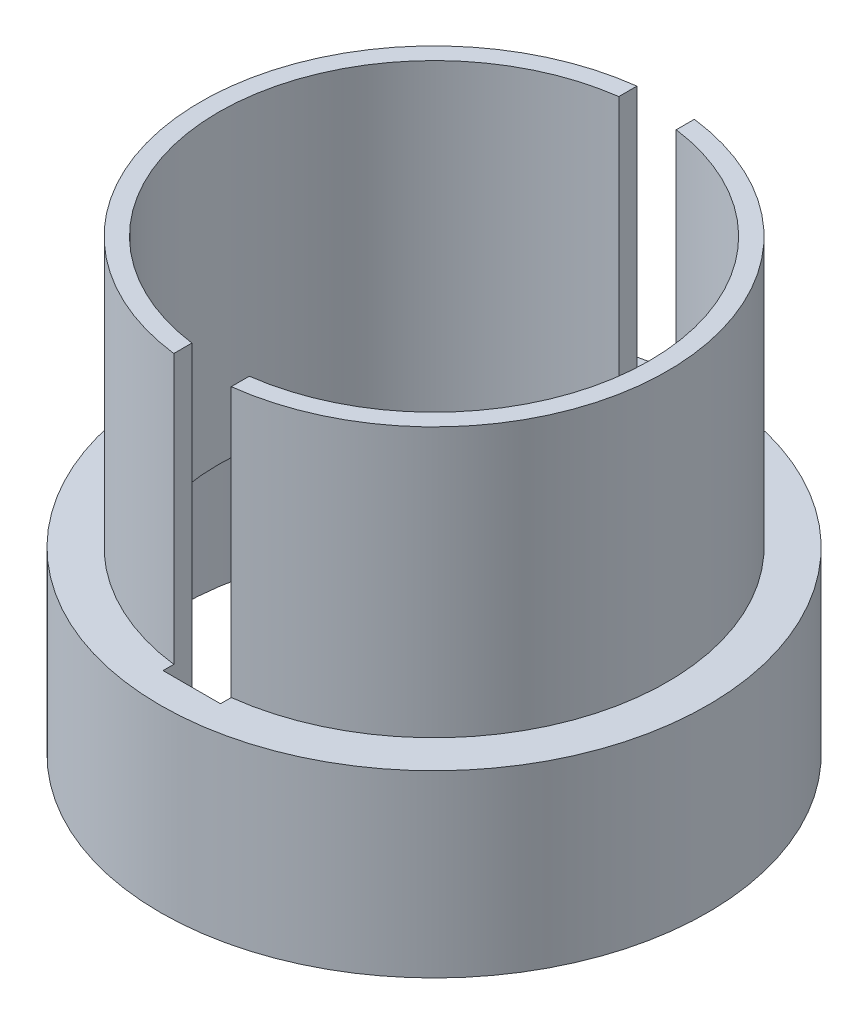
ISO-10303-21;
HEADER;
FILE_DESCRIPTION(('STEP AP214'),'2;1');
FILE_NAME('part.step','',(''),(''),'','','');
FILE_SCHEMA(('AUTOMOTIVE_DESIGN { 1 0 10303 214 1 1 1 1 }'));
ENDSEC;
DATA;
#1=APPLICATION_CONTEXT('core data for automotive mechanical design processes');
#2=APPLICATION_PROTOCOL_DEFINITION('international standard','automotive_design',2000,#1);
#3=PRODUCT_CONTEXT('',#1,'mechanical');
#4=PRODUCT('Part','Part','',(#3));
#5=PRODUCT_RELATED_PRODUCT_CATEGORY('part','',(#4));
#6=PRODUCT_DEFINITION_FORMATION('','',#4);
#7=PRODUCT_DEFINITION_CONTEXT('part definition',#1,'design');
#8=PRODUCT_DEFINITION('design','',#6,#7);
#9=PRODUCT_DEFINITION_SHAPE('','',#8);
#10=(LENGTH_UNIT() NAMED_UNIT(*) SI_UNIT(.MILLI.,.METRE.));
#11=(NAMED_UNIT(*) PLANE_ANGLE_UNIT() SI_UNIT($,.RADIAN.));
#12=(NAMED_UNIT(*) SI_UNIT($,.STERADIAN.) SOLID_ANGLE_UNIT());
#13=UNCERTAINTY_MEASURE_WITH_UNIT(LENGTH_MEASURE(1.E-05),#10,'distance_accuracy_value','');
#14=(GEOMETRIC_REPRESENTATION_CONTEXT(3) GLOBAL_UNCERTAINTY_ASSIGNED_CONTEXT((#13)) GLOBAL_UNIT_ASSIGNED_CONTEXT((#10,
#11,#12)) REPRESENTATION_CONTEXT('',''));
#15=CARTESIAN_POINT('',(0.,0.,0.));
#16=DIRECTION('',(0.,0.,1.));
#17=DIRECTION('',(1.,0.,0.));
#18=AXIS2_PLACEMENT_3D('',#15,#16,#17);
#19=CARTESIAN_POINT('',(0.,10.,0.));
#20=DIRECTION('',(0.,1.,0.));
#21=DIRECTION('',(0.,0.,1.));
#22=AXIS2_PLACEMENT_3D('',#19,#20,#21);
#23=PLANE('',#22);
#24=DIRECTION('',(0.,0.,-1.));
#25=VECTOR('',#24,1.);
#26=CARTESIAN_POINT('',(1.6,10.,0.));
#27=LINE('',#26,#25);
#28=CARTESIAN_POINT('',(1.6,10.,-12.9011627382961));
#29=VERTEX_POINT('',#28);
#30=CARTESIAN_POINT('',(1.6,10.,-13.5));
#31=VERTEX_POINT('',#30);
#32=EDGE_CURVE('E256',#29,#31,#27,.T.);
#33=ORIENTED_EDGE('',*,*,#32,.F.);
#34=CARTESIAN_POINT('',(0.,10.,0.));
#35=DIRECTION('',(0.,1.,0.));
#36=DIRECTION('',(0.,0.,1.));
#37=AXIS2_PLACEMENT_3D('',#34,#35,#36);
#38=CIRCLE('',#37,13.);
#39=CARTESIAN_POINT('',(1.6,10.,12.9011627382961));
#40=VERTEX_POINT('',#39);
#41=EDGE_CURVE('E172',#40,#29,#38,.T.);
#42=ORIENTED_EDGE('',*,*,#41,.F.);
#43=DIRECTION('',(0.,0.,1.));
#44=VECTOR('',#43,1.);
#45=CARTESIAN_POINT('',(1.6,10.,0.));
#46=LINE('',#45,#44);
#47=CARTESIAN_POINT('',(1.6,10.,13.5));
#48=VERTEX_POINT('',#47);
#49=EDGE_CURVE('E245',#40,#48,#46,.T.);
#50=ORIENTED_EDGE('',*,*,#49,.T.);
#51=DIRECTION('',(1.,0.,0.));
#52=VECTOR('',#51,1.);
#53=CARTESIAN_POINT('',(0.,10.,13.5));
#54=LINE('',#53,#52);
#55=CARTESIAN_POINT('',(-1.6,10.,13.5));
#56=VERTEX_POINT('',#55);
#57=EDGE_CURVE('E163',#56,#48,#54,.T.);
#58=ORIENTED_EDGE('',*,*,#57,.F.);
#59=DIRECTION('',(0.,0.,1.));
#60=VECTOR('',#59,1.);
#61=CARTESIAN_POINT('',(-1.6,10.,0.));
#62=LINE('',#61,#60);
#63=CARTESIAN_POINT('',(-1.6,10.,12.9011627382961));
#64=VERTEX_POINT('',#63);
#65=EDGE_CURVE('E226',#64,#56,#62,.T.);
#66=ORIENTED_EDGE('',*,*,#65,.F.);
#67=CARTESIAN_POINT('',(-1.6,10.,-12.9011627382961));
#68=VERTEX_POINT('',#67);
#69=EDGE_CURVE('E161',#68,#64,#38,.T.);
#70=ORIENTED_EDGE('',*,*,#69,.F.);
#71=DIRECTION('',(0.,0.,-1.));
#72=VECTOR('',#71,1.);
#73=CARTESIAN_POINT('',(-1.6,10.,0.));
#74=LINE('',#73,#72);
#75=CARTESIAN_POINT('',(-1.6,10.,-13.5));
#76=VERTEX_POINT('',#75);
#77=EDGE_CURVE('E55',#68,#76,#74,.T.);
#78=ORIENTED_EDGE('',*,*,#77,.T.);
#79=DIRECTION('',(1.,0.,0.));
#80=VECTOR('',#79,1.);
#81=CARTESIAN_POINT('',(0.,10.,-13.5));
#82=LINE('',#81,#80);
#83=EDGE_CURVE('E156',#76,#31,#82,.T.);
#84=ORIENTED_EDGE('',*,*,#83,.T.);
#85=EDGE_LOOP('',(#33,#42,#50,#58,#66,#70,#78,#84));
#86=FACE_BOUND('',#85,.T.);
#87=CARTESIAN_POINT('',(0.,10.,0.));
#88=DIRECTION('',(0.,1.,0.));
#89=DIRECTION('',(0.,0.,1.));
#90=AXIS2_PLACEMENT_3D('',#87,#88,#89);
#91=CIRCLE('',#90,15.25);
#92=CARTESIAN_POINT('',(0.,10.,15.25));
#93=VERTEX_POINT('',#92);
#94=EDGE_CURVE('E189',#93,#93,#91,.T.);
#95=ORIENTED_EDGE('',*,*,#94,.T.);
#96=EDGE_LOOP('',(#95));
#97=FACE_BOUND('',#96,.T.);
#98=ADVANCED_FACE('F39',(#86,#97),#23,.T.);
#99=CARTESIAN_POINT('',(0.,8.,0.));
#100=DIRECTION('',(0.,1.,0.));
#101=DIRECTION('',(0.,0.,1.));
#102=AXIS2_PLACEMENT_3D('',#99,#100,#101);
#103=PLANE('',#102);
#104=CARTESIAN_POINT('',(0.,8.,0.));
#105=DIRECTION('',(0.,1.,0.));
#106=DIRECTION('',(0.,0.,1.));
#107=AXIS2_PLACEMENT_3D('',#104,#105,#106);
#108=CIRCLE('',#107,14.25);
#109=CARTESIAN_POINT('',(0.,8.,14.25));
#110=VERTEX_POINT('',#109);
#111=EDGE_CURVE('E180',#110,#110,#108,.T.);
#112=ORIENTED_EDGE('',*,*,#111,.F.);
#113=EDGE_LOOP('',(#112));
#114=FACE_BOUND('',#113,.T.);
#115=CARTESIAN_POINT('',(0.,8.,0.));
#116=DIRECTION('',(0.,1.,0.));
#117=DIRECTION('',(0.,0.,1.));
#118=AXIS2_PLACEMENT_3D('',#115,#116,#117);
#119=CIRCLE('',#118,12.);
#120=CARTESIAN_POINT('',(1.6,8.,11.8928549978548));
#121=VERTEX_POINT('',#120);
#122=CARTESIAN_POINT('',(1.6,8.,-11.8928549978548));
#123=VERTEX_POINT('',#122);
#124=EDGE_CURVE('E176',#121,#123,#119,.T.);
#125=ORIENTED_EDGE('',*,*,#124,.T.);
#126=DIRECTION('',(0.,0.,-1.));
#127=VECTOR('',#126,1.);
#128=CARTESIAN_POINT('',(1.6,8.,0.));
#129=LINE('',#128,#127);
#130=CARTESIAN_POINT('',(1.6,8.,-13.5));
#131=VERTEX_POINT('',#130);
#132=EDGE_CURVE('E259',#123,#131,#129,.T.);
#133=ORIENTED_EDGE('',*,*,#132,.T.);
#134=DIRECTION('',(1.,0.,0.));
#135=VECTOR('',#134,1.);
#136=CARTESIAN_POINT('',(0.,8.,-13.5));
#137=LINE('',#136,#135);
#138=CARTESIAN_POINT('',(-1.6,8.,-13.5));
#139=VERTEX_POINT('',#138);
#140=EDGE_CURVE('E11',#139,#131,#137,.T.);
#141=ORIENTED_EDGE('',*,*,#140,.F.);
#142=DIRECTION('',(0.,0.,-1.));
#143=VECTOR('',#142,1.);
#144=CARTESIAN_POINT('',(-1.6,8.,0.));
#145=LINE('',#144,#143);
#146=CARTESIAN_POINT('',(-1.6,8.,-11.8928549978548));
#147=VERTEX_POINT('',#146);
#148=EDGE_CURVE('E253',#147,#139,#145,.T.);
#149=ORIENTED_EDGE('',*,*,#148,.F.);
#150=CARTESIAN_POINT('',(-1.6,8.,11.8928549978548));
#151=VERTEX_POINT('',#150);
#152=EDGE_CURVE('E148',#147,#151,#119,.T.);
#153=ORIENTED_EDGE('',*,*,#152,.T.);
#154=DIRECTION('',(0.,0.,1.));
#155=VECTOR('',#154,1.);
#156=CARTESIAN_POINT('',(-1.6,8.,0.));
#157=LINE('',#156,#155);
#158=CARTESIAN_POINT('',(-1.6,8.,13.5));
#159=VERTEX_POINT('',#158);
#160=EDGE_CURVE('E215',#151,#159,#157,.T.);
#161=ORIENTED_EDGE('',*,*,#160,.T.);
#162=DIRECTION('',(1.,0.,0.));
#163=VECTOR('',#162,1.);
#164=CARTESIAN_POINT('',(0.,8.,13.5));
#165=LINE('',#164,#163);
#166=CARTESIAN_POINT('',(1.6,8.,13.5));
#167=VERTEX_POINT('',#166);
#168=EDGE_CURVE('E48',#159,#167,#165,.T.);
#169=ORIENTED_EDGE('',*,*,#168,.T.);
#170=DIRECTION('',(0.,0.,1.));
#171=VECTOR('',#170,1.);
#172=CARTESIAN_POINT('',(1.6,8.,0.));
#173=LINE('',#172,#171);
#174=EDGE_CURVE('E213',#121,#167,#173,.T.);
#175=ORIENTED_EDGE('',*,*,#174,.F.);
#176=EDGE_LOOP('',(#125,#133,#141,#149,#153,#161,#169,#175));
#177=FACE_BOUND('',#176,.T.);
#178=ADVANCED_FACE('F212',(#114,#177),#103,.F.);
#179=CARTESIAN_POINT('',(0.,8.,0.));
#180=DIRECTION('',(0.,1.,0.));
#181=DIRECTION('',(0.,0.,1.));
#182=AXIS2_PLACEMENT_3D('',#179,#180,#181);
#183=CYLINDRICAL_SURFACE('',#182,12.);
#184=DIRECTION('',(0.,1.,0.));
#185=VECTOR('',#184,1.);
#186=CARTESIAN_POINT('',(-1.6,0.,-11.8928549978548));
#187=LINE('',#186,#185);
#188=CARTESIAN_POINT('',(-1.6,25.,-11.8928549978548));
#189=VERTEX_POINT('',#188);
#190=EDGE_CURVE('E130',#147,#189,#187,.T.);
#191=ORIENTED_EDGE('',*,*,#190,.T.);
#192=CARTESIAN_POINT('',(0.,25.,0.));
#193=DIRECTION('',(0.,1.,0.));
#194=DIRECTION('',(0.,0.,1.));
#195=AXIS2_PLACEMENT_3D('',#192,#193,#194);
#196=CIRCLE('',#195,12.);
#197=CARTESIAN_POINT('',(-1.6,25.,11.8928549978548));
#198=VERTEX_POINT('',#197);
#199=EDGE_CURVE('E146',#189,#198,#196,.T.);
#200=ORIENTED_EDGE('',*,*,#199,.T.);
#201=DIRECTION('',(0.,1.,0.));
#202=VECTOR('',#201,1.);
#203=CARTESIAN_POINT('',(-1.6,0.,11.8928549978548));
#204=LINE('',#203,#202);
#205=EDGE_CURVE('E228',#151,#198,#204,.T.);
#206=ORIENTED_EDGE('',*,*,#205,.F.);
#207=ORIENTED_EDGE('',*,*,#152,.F.);
#208=EDGE_LOOP('',(#191,#200,#206,#207));
#209=FACE_BOUND('',#208,.T.);
#210=ADVANCED_FACE('F144',(#209),#183,.F.);
#211=CARTESIAN_POINT('',(1.6,25.,11.8928549978548));
#212=VERTEX_POINT('',#211);
#213=CARTESIAN_POINT('',(1.6,25.,-11.8928549978548));
#214=VERTEX_POINT('',#213);
#215=EDGE_CURVE('E155',#212,#214,#196,.T.);
#216=ORIENTED_EDGE('',*,*,#215,.T.);
#217=DIRECTION('',(0.,1.,0.));
#218=VECTOR('',#217,1.);
#219=CARTESIAN_POINT('',(1.6,0.,-11.8928549978548));
#220=LINE('',#219,#218);
#221=EDGE_CURVE('E150',#123,#214,#220,.T.);
#222=ORIENTED_EDGE('',*,*,#221,.F.);
#223=ORIENTED_EDGE('',*,*,#124,.F.);
#224=DIRECTION('',(0.,1.,0.));
#225=VECTOR('',#224,1.);
#226=CARTESIAN_POINT('',(1.6,0.,11.8928549978548));
#227=LINE('',#226,#225);
#228=EDGE_CURVE('E233',#121,#212,#227,.T.);
#229=ORIENTED_EDGE('',*,*,#228,.T.);
#230=EDGE_LOOP('',(#216,#222,#223,#229));
#231=FACE_BOUND('',#230,.T.);
#232=ADVANCED_FACE('F295',(#231),#183,.F.);
#233=CARTESIAN_POINT('',(0.,25.,0.));
#234=DIRECTION('',(0.,1.,0.));
#235=DIRECTION('',(0.,0.,1.));
#236=AXIS2_PLACEMENT_3D('',#233,#234,#235);
#237=PLANE('',#236);
#238=ORIENTED_EDGE('',*,*,#199,.F.);
#239=DIRECTION('',(0.,0.,-1.));
#240=VECTOR('',#239,1.);
#241=CARTESIAN_POINT('',(-1.6,25.,0.));
#242=LINE('',#241,#240);
#243=CARTESIAN_POINT('',(-1.6,25.,-12.9011627382961));
#244=VERTEX_POINT('',#243);
#245=EDGE_CURVE('E127',#189,#244,#242,.T.);
#246=ORIENTED_EDGE('',*,*,#245,.T.);
#247=CARTESIAN_POINT('',(0.,25.,0.));
#248=DIRECTION('',(0.,1.,0.));
#249=DIRECTION('',(0.,0.,1.));
#250=AXIS2_PLACEMENT_3D('',#247,#248,#249);
#251=CIRCLE('',#250,13.);
#252=CARTESIAN_POINT('',(-1.6,25.,12.9011627382961));
#253=VERTEX_POINT('',#252);
#254=EDGE_CURVE('E171',#244,#253,#251,.T.);
#255=ORIENTED_EDGE('',*,*,#254,.T.);
#256=DIRECTION('',(0.,0.,1.));
#257=VECTOR('',#256,1.);
#258=CARTESIAN_POINT('',(-1.6,25.,0.));
#259=LINE('',#258,#257);
#260=EDGE_CURVE('E63',#198,#253,#259,.T.);
#261=ORIENTED_EDGE('',*,*,#260,.F.);
#262=EDGE_LOOP('',(#238,#246,#255,#261));
#263=FACE_BOUND('',#262,.T.);
#264=ADVANCED_FACE('F153',(#263),#237,.T.);
#265=DIRECTION('',(0.,0.,-1.));
#266=VECTOR('',#265,1.);
#267=CARTESIAN_POINT('',(1.6,25.,0.));
#268=LINE('',#267,#266);
#269=CARTESIAN_POINT('',(1.6,25.,-12.9011627382961));
#270=VERTEX_POINT('',#269);
#271=EDGE_CURVE('E138',#214,#270,#268,.T.);
#272=ORIENTED_EDGE('',*,*,#271,.F.);
#273=ORIENTED_EDGE('',*,*,#215,.F.);
#274=DIRECTION('',(0.,0.,1.));
#275=VECTOR('',#274,1.);
#276=CARTESIAN_POINT('',(1.6,25.,0.));
#277=LINE('',#276,#275);
#278=CARTESIAN_POINT('',(1.6,25.,12.9011627382961));
#279=VERTEX_POINT('',#278);
#280=EDGE_CURVE('E274',#212,#279,#277,.T.);
#281=ORIENTED_EDGE('',*,*,#280,.T.);
#282=EDGE_CURVE('E167',#279,#270,#251,.T.);
#283=ORIENTED_EDGE('',*,*,#282,.T.);
#284=EDGE_LOOP('',(#272,#273,#281,#283));
#285=FACE_BOUND('',#284,.T.);
#286=ADVANCED_FACE('F278',(#285),#237,.T.);
#287=CARTESIAN_POINT('',(0.,25.,0.));
#288=DIRECTION('',(0.,-1.,0.));
#289=DIRECTION('',(0.,0.,-1.));
#290=AXIS2_PLACEMENT_3D('',#287,#288,#289);
#291=CYLINDRICAL_SURFACE('',#290,13.);
#292=DIRECTION('',(0.,-1.,0.));
#293=VECTOR('',#292,1.);
#294=CARTESIAN_POINT('',(-1.6,25.,-12.9011627382961));
#295=LINE('',#294,#293);
#296=EDGE_CURVE('E132',#68,#244,#295,.F.);
#297=ORIENTED_EDGE('',*,*,#296,.F.);
#298=ORIENTED_EDGE('',*,*,#69,.T.);
#299=DIRECTION('',(0.,-1.,0.));
#300=VECTOR('',#299,1.);
#301=CARTESIAN_POINT('',(-1.6,25.,12.9011627382961));
#302=LINE('',#301,#300);
#303=EDGE_CURVE('E193',#64,#253,#302,.F.);
#304=ORIENTED_EDGE('',*,*,#303,.T.);
#305=ORIENTED_EDGE('',*,*,#254,.F.);
#306=EDGE_LOOP('',(#297,#298,#304,#305));
#307=FACE_BOUND('',#306,.T.);
#308=ADVANCED_FACE('F307',(#307),#291,.T.);
#309=ORIENTED_EDGE('',*,*,#41,.T.);
#310=DIRECTION('',(0.,-1.,0.));
#311=VECTOR('',#310,1.);
#312=CARTESIAN_POINT('',(1.6,25.,-12.9011627382961));
#313=LINE('',#312,#311);
#314=EDGE_CURVE('E204',#29,#270,#313,.F.);
#315=ORIENTED_EDGE('',*,*,#314,.T.);
#316=ORIENTED_EDGE('',*,*,#282,.F.);
#317=DIRECTION('',(0.,-1.,0.));
#318=VECTOR('',#317,1.);
#319=CARTESIAN_POINT('',(1.6,25.,12.9011627382961));
#320=LINE('',#319,#318);
#321=EDGE_CURVE('E199',#40,#279,#320,.F.);
#322=ORIENTED_EDGE('',*,*,#321,.F.);
#323=EDGE_LOOP('',(#309,#315,#316,#322));
#324=FACE_BOUND('',#323,.T.);
#325=ADVANCED_FACE('F271',(#324),#291,.T.);
#326=CARTESIAN_POINT('',(0.,10.,0.));
#327=DIRECTION('',(0.,-1.,0.));
#328=DIRECTION('',(0.,0.,-1.));
#329=AXIS2_PLACEMENT_3D('',#326,#327,#328);
#330=CYLINDRICAL_SURFACE('',#329,14.25);
#331=CARTESIAN_POINT('',(0.,0.,0.));
#332=DIRECTION('',(0.,1.,0.));
#333=DIRECTION('',(0.,0.,1.));
#334=AXIS2_PLACEMENT_3D('',#331,#332,#333);
#335=CIRCLE('',#334,14.25);
#336=CARTESIAN_POINT('',(0.,0.,14.25));
#337=VERTEX_POINT('',#336);
#338=EDGE_CURVE('E184',#337,#337,#335,.T.);
#339=ORIENTED_EDGE('',*,*,#338,.F.);
#340=EDGE_LOOP('',(#339));
#341=FACE_BOUND('',#340,.T.);
#342=ORIENTED_EDGE('',*,*,#111,.T.);
#343=EDGE_LOOP('',(#342));
#344=FACE_BOUND('',#343,.T.);
#345=ADVANCED_FACE('F314',(#341,#344),#330,.F.);
#346=CARTESIAN_POINT('',(0.,0.,0.));
#347=DIRECTION('',(0.,1.,0.));
#348=DIRECTION('',(0.,0.,1.));
#349=AXIS2_PLACEMENT_3D('',#346,#347,#348);
#350=PLANE('',#349);
#351=CARTESIAN_POINT('',(0.,0.,0.));
#352=DIRECTION('',(0.,1.,0.));
#353=DIRECTION('',(0.,0.,1.));
#354=AXIS2_PLACEMENT_3D('',#351,#352,#353);
#355=CIRCLE('',#354,15.25);
#356=CARTESIAN_POINT('',(0.,0.,15.25));
#357=VERTEX_POINT('',#356);
#358=EDGE_CURVE('E188',#357,#357,#355,.T.);
#359=ORIENTED_EDGE('',*,*,#358,.F.);
#360=EDGE_LOOP('',(#359));
#361=FACE_BOUND('',#360,.T.);
#362=ORIENTED_EDGE('',*,*,#338,.T.);
#363=EDGE_LOOP('',(#362));
#364=FACE_BOUND('',#363,.T.);
#365=ADVANCED_FACE('F325',(#361,#364),#350,.F.);
#366=CARTESIAN_POINT('',(0.,10.,0.));
#367=DIRECTION('',(0.,-1.,0.));
#368=DIRECTION('',(0.,0.,-1.));
#369=AXIS2_PLACEMENT_3D('',#366,#367,#368);
#370=CYLINDRICAL_SURFACE('',#369,15.25);
#371=ORIENTED_EDGE('',*,*,#94,.F.);
#372=EDGE_LOOP('',(#371));
#373=FACE_BOUND('',#372,.T.);
#374=ORIENTED_EDGE('',*,*,#358,.T.);
#375=EDGE_LOOP('',(#374));
#376=FACE_BOUND('',#375,.T.);
#377=ADVANCED_FACE('F41',(#373,#376),#370,.T.);
#378=CARTESIAN_POINT('',(0.,0.,13.5));
#379=DIRECTION('',(0.,0.,1.));
#380=DIRECTION('',(1.,0.,0.));
#381=AXIS2_PLACEMENT_3D('',#378,#379,#380);
#382=PLANE('',#381);
#383=ORIENTED_EDGE('',*,*,#57,.T.);
#384=DIRECTION('',(0.,1.,0.));
#385=VECTOR('',#384,1.);
#386=CARTESIAN_POINT('',(1.6,0.,13.5));
#387=LINE('',#386,#385);
#388=EDGE_CURVE('E139',#167,#48,#387,.T.);
#389=ORIENTED_EDGE('',*,*,#388,.F.);
#390=ORIENTED_EDGE('',*,*,#168,.F.);
#391=DIRECTION('',(0.,1.,0.));
#392=VECTOR('',#391,1.);
#393=CARTESIAN_POINT('',(-1.6,0.,13.5));
#394=LINE('',#393,#392);
#395=EDGE_CURVE('E221',#159,#56,#394,.T.);
#396=ORIENTED_EDGE('',*,*,#395,.T.);
#397=EDGE_LOOP('',(#383,#389,#390,#396));
#398=FACE_BOUND('',#397,.T.);
#399=ADVANCED_FACE('F220',(#398),#382,.F.);
#400=CARTESIAN_POINT('',(1.6,0.,0.));
#401=DIRECTION('',(-1.,0.,0.));
#402=DIRECTION('',(0.,0.,1.));
#403=AXIS2_PLACEMENT_3D('',#400,#401,#402);
#404=PLANE('',#403);
#405=ORIENTED_EDGE('',*,*,#174,.T.);
#406=ORIENTED_EDGE('',*,*,#388,.T.);
#407=ORIENTED_EDGE('',*,*,#49,.F.);
#408=ORIENTED_EDGE('',*,*,#321,.T.);
#409=ORIENTED_EDGE('',*,*,#280,.F.);
#410=ORIENTED_EDGE('',*,*,#228,.F.);
#411=EDGE_LOOP('',(#405,#406,#407,#408,#409,#410));
#412=FACE_BOUND('',#411,.T.);
#413=ADVANCED_FACE('F265',(#412),#404,.T.);
#414=CARTESIAN_POINT('',(-1.6,0.,0.));
#415=DIRECTION('',(-1.,0.,0.));
#416=DIRECTION('',(0.,0.,1.));
#417=AXIS2_PLACEMENT_3D('',#414,#415,#416);
#418=PLANE('',#417);
#419=ORIENTED_EDGE('',*,*,#205,.T.);
#420=ORIENTED_EDGE('',*,*,#260,.T.);
#421=ORIENTED_EDGE('',*,*,#303,.F.);
#422=ORIENTED_EDGE('',*,*,#65,.T.);
#423=ORIENTED_EDGE('',*,*,#395,.F.);
#424=ORIENTED_EDGE('',*,*,#160,.F.);
#425=EDGE_LOOP('',(#419,#420,#421,#422,#423,#424));
#426=FACE_BOUND('',#425,.T.);
#427=ADVANCED_FACE('F224',(#426),#418,.F.);
#428=CARTESIAN_POINT('',(0.,0.,-13.5));
#429=DIRECTION('',(0.,0.,1.));
#430=DIRECTION('',(1.,0.,0.));
#431=AXIS2_PLACEMENT_3D('',#428,#429,#430);
#432=PLANE('',#431);
#433=DIRECTION('',(0.,1.,0.));
#434=VECTOR('',#433,1.);
#435=CARTESIAN_POINT('',(-1.6,0.,-13.5));
#436=LINE('',#435,#434);
#437=EDGE_CURVE('E151',#139,#76,#436,.T.);
#438=ORIENTED_EDGE('',*,*,#437,.F.);
#439=ORIENTED_EDGE('',*,*,#140,.T.);
#440=DIRECTION('',(0.,1.,0.));
#441=VECTOR('',#440,1.);
#442=CARTESIAN_POINT('',(1.6,0.,-13.5));
#443=LINE('',#442,#441);
#444=EDGE_CURVE('E242',#131,#31,#443,.T.);
#445=ORIENTED_EDGE('',*,*,#444,.T.);
#446=ORIENTED_EDGE('',*,*,#83,.F.);
#447=EDGE_LOOP('',(#438,#439,#445,#446));
#448=FACE_BOUND('',#447,.T.);
#449=ADVANCED_FACE('F300',(#448),#432,.T.);
#450=CARTESIAN_POINT('',(1.6,0.,0.));
#451=DIRECTION('',(1.,0.,0.));
#452=DIRECTION('',(0.,0.,-1.));
#453=AXIS2_PLACEMENT_3D('',#450,#451,#452);
#454=PLANE('',#453);
#455=ORIENTED_EDGE('',*,*,#221,.T.);
#456=ORIENTED_EDGE('',*,*,#271,.T.);
#457=ORIENTED_EDGE('',*,*,#314,.F.);
#458=ORIENTED_EDGE('',*,*,#32,.T.);
#459=ORIENTED_EDGE('',*,*,#444,.F.);
#460=ORIENTED_EDGE('',*,*,#132,.F.);
#461=EDGE_LOOP('',(#455,#456,#457,#458,#459,#460));
#462=FACE_BOUND('',#461,.T.);
#463=ADVANCED_FACE('F292',(#462),#454,.F.);
#464=CARTESIAN_POINT('',(-1.6,0.,0.));
#465=DIRECTION('',(1.,0.,0.));
#466=DIRECTION('',(0.,0.,-1.));
#467=AXIS2_PLACEMENT_3D('',#464,#465,#466);
#468=PLANE('',#467);
#469=ORIENTED_EDGE('',*,*,#148,.T.);
#470=ORIENTED_EDGE('',*,*,#437,.T.);
#471=ORIENTED_EDGE('',*,*,#77,.F.);
#472=ORIENTED_EDGE('',*,*,#296,.T.);
#473=ORIENTED_EDGE('',*,*,#245,.F.);
#474=ORIENTED_EDGE('',*,*,#190,.F.);
#475=EDGE_LOOP('',(#469,#470,#471,#472,#473,#474));
#476=FACE_BOUND('',#475,.T.);
#477=ADVANCED_FACE('F129',(#476),#468,.T.);
#478=CLOSED_SHELL('',(#98,#178,#210,#232,#264,#286,#308,#325,#345,#365,#377,#399,#413,#427,#449,
#463,#477));
#479=MANIFOLD_SOLID_BREP('B2',#478);
#480=ADVANCED_BREP_SHAPE_REPRESENTATION('',(#18,#479),#14);
#481=SHAPE_DEFINITION_REPRESENTATION(#9,#480);
ENDSEC;
END-ISO-10303-21;
